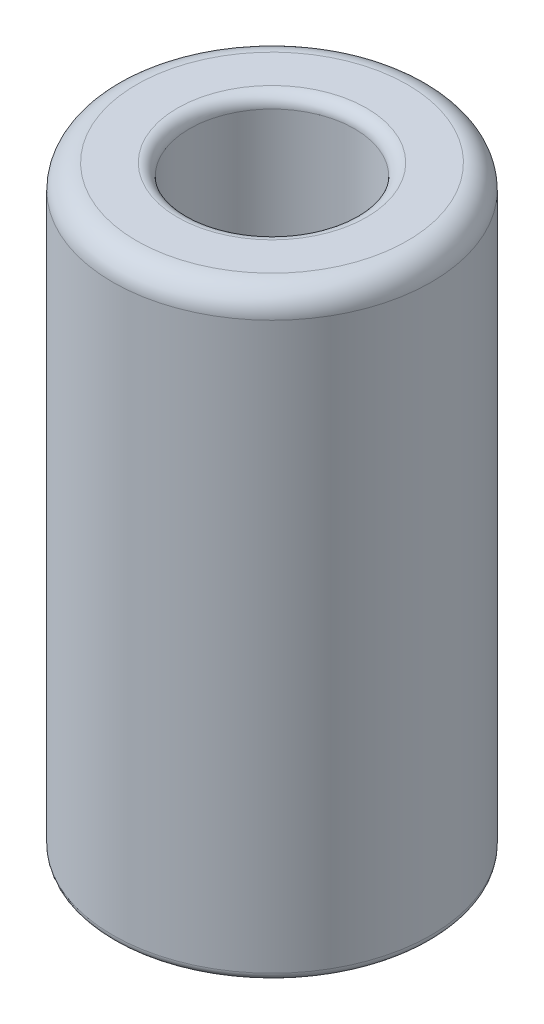
ISO-10303-21;
HEADER;
FILE_DESCRIPTION(('STEP AP214'),'2;1');
FILE_NAME('part.step','',(''),(''),'','','');
FILE_SCHEMA(('AUTOMOTIVE_DESIGN { 1 0 10303 214 1 1 1 1 }'));
ENDSEC;
DATA;
#1=APPLICATION_CONTEXT('core data for automotive mechanical design processes');
#2=APPLICATION_PROTOCOL_DEFINITION('international standard','automotive_design',2000,#1);
#3=PRODUCT_CONTEXT('',#1,'mechanical');
#4=PRODUCT('Part','Part','',(#3));
#5=PRODUCT_RELATED_PRODUCT_CATEGORY('part','',(#4));
#6=PRODUCT_DEFINITION_FORMATION('','',#4);
#7=PRODUCT_DEFINITION_CONTEXT('part definition',#1,'design');
#8=PRODUCT_DEFINITION('design','',#6,#7);
#9=PRODUCT_DEFINITION_SHAPE('','',#8);
#10=(LENGTH_UNIT() NAMED_UNIT(*) SI_UNIT(.MILLI.,.METRE.));
#11=(NAMED_UNIT(*) PLANE_ANGLE_UNIT() SI_UNIT($,.RADIAN.));
#12=(NAMED_UNIT(*) SI_UNIT($,.STERADIAN.) SOLID_ANGLE_UNIT());
#13=UNCERTAINTY_MEASURE_WITH_UNIT(LENGTH_MEASURE(1.E-05),#10,'distance_accuracy_value','');
#14=(GEOMETRIC_REPRESENTATION_CONTEXT(3) GLOBAL_UNCERTAINTY_ASSIGNED_CONTEXT((#13)) GLOBAL_UNIT_ASSIGNED_CONTEXT((#10,
#11,#12)) REPRESENTATION_CONTEXT('',''));
#15=CARTESIAN_POINT('',(0.,0.,0.));
#16=DIRECTION('',(0.,0.,1.));
#17=DIRECTION('',(1.,0.,0.));
#18=AXIS2_PLACEMENT_3D('',#15,#16,#17);
#19=CARTESIAN_POINT('',(0.,1.,0.));
#20=DIRECTION('',(0.,1.,0.));
#21=DIRECTION('',(0.,0.,1.));
#22=AXIS2_PLACEMENT_3D('',#19,#20,#21);
#23=TOROIDAL_SURFACE('',#22,19.,1.);
#24=CARTESIAN_POINT('',(0.,0.,0.));
#25=DIRECTION('',(0.,1.,0.));
#26=DIRECTION('',(0.,0.,1.));
#27=AXIS2_PLACEMENT_3D('',#24,#25,#26);
#28=CIRCLE('',#27,19.);
#29=CARTESIAN_POINT('',(0.,0.,19.));
#30=VERTEX_POINT('',#29);
#31=EDGE_CURVE('E37',#30,#30,#28,.F.);
#32=ORIENTED_EDGE('',*,*,#31,.F.);
#33=EDGE_LOOP('',(#32));
#34=FACE_BOUND('',#33,.T.);
#35=CARTESIAN_POINT('',(0.,1.,0.));
#36=DIRECTION('',(0.,1.,0.));
#37=DIRECTION('',(0.,0.,1.));
#38=AXIS2_PLACEMENT_3D('',#35,#36,#37);
#39=CIRCLE('',#38,20.);
#40=CARTESIAN_POINT('',(0.,1.,20.));
#41=VERTEX_POINT('',#40);
#42=EDGE_CURVE('E10',#41,#41,#39,.T.);
#43=ORIENTED_EDGE('',*,*,#42,.F.);
#44=EDGE_LOOP('',(#43));
#45=FACE_BOUND('',#44,.T.);
#46=ADVANCED_FACE('F31',(#34,#45),#23,.T.);
#47=CARTESIAN_POINT('',(0.,72.,0.));
#48=DIRECTION('',(0.,1.,0.));
#49=DIRECTION('',(0.,0.,1.));
#50=AXIS2_PLACEMENT_3D('',#47,#48,#49);
#51=TOROIDAL_SURFACE('',#50,17.,3.);
#52=CARTESIAN_POINT('',(0.,75.,0.));
#53=DIRECTION('',(0.,1.,0.));
#54=DIRECTION('',(0.,0.,1.));
#55=AXIS2_PLACEMENT_3D('',#52,#53,#54);
#56=CIRCLE('',#55,17.);
#57=CARTESIAN_POINT('',(0.,75.,17.));
#58=VERTEX_POINT('',#57);
#59=EDGE_CURVE('E45',#58,#58,#56,.T.);
#60=ORIENTED_EDGE('',*,*,#59,.F.);
#61=EDGE_LOOP('',(#60));
#62=FACE_BOUND('',#61,.T.);
#63=CARTESIAN_POINT('',(0.,72.,0.));
#64=DIRECTION('',(0.,1.,0.));
#65=DIRECTION('',(0.,0.,1.));
#66=AXIS2_PLACEMENT_3D('',#63,#64,#65);
#67=CIRCLE('',#66,20.);
#68=CARTESIAN_POINT('',(0.,72.,20.));
#69=VERTEX_POINT('',#68);
#70=EDGE_CURVE('E41',#69,#69,#67,.F.);
#71=ORIENTED_EDGE('',*,*,#70,.F.);
#72=EDGE_LOOP('',(#71));
#73=FACE_BOUND('',#72,.T.);
#74=ADVANCED_FACE('F88',(#62,#73),#51,.T.);
#75=CARTESIAN_POINT('',(0.,73.5,0.));
#76=DIRECTION('',(0.,1.,0.));
#77=DIRECTION('',(0.,0.,1.));
#78=AXIS2_PLACEMENT_3D('',#75,#76,#77);
#79=TOROIDAL_SURFACE('',#78,11.875,1.5);
#80=CARTESIAN_POINT('',(0.,75.,0.));
#81=DIRECTION('',(0.,1.,0.));
#82=DIRECTION('',(0.,0.,1.));
#83=AXIS2_PLACEMENT_3D('',#80,#81,#82);
#84=CIRCLE('',#83,11.875);
#85=CARTESIAN_POINT('',(0.,75.,11.875));
#86=VERTEX_POINT('',#85);
#87=EDGE_CURVE('E53',#86,#86,#84,.F.);
#88=ORIENTED_EDGE('',*,*,#87,.F.);
#89=EDGE_LOOP('',(#88));
#90=FACE_BOUND('',#89,.T.);
#91=CARTESIAN_POINT('',(0.,73.5,0.));
#92=DIRECTION('',(0.,1.,0.));
#93=DIRECTION('',(0.,0.,1.));
#94=AXIS2_PLACEMENT_3D('',#91,#92,#93);
#95=CIRCLE('',#94,10.375);
#96=CARTESIAN_POINT('',(0.,73.5,10.375));
#97=VERTEX_POINT('',#96);
#98=EDGE_CURVE('E50',#97,#97,#95,.T.);
#99=ORIENTED_EDGE('',*,*,#98,.F.);
#100=EDGE_LOOP('',(#99));
#101=FACE_BOUND('',#100,.T.);
#102=ADVANCED_FACE('F93',(#90,#101),#79,.T.);
#103=CARTESIAN_POINT('',(0.,1.5,0.));
#104=DIRECTION('',(0.,1.,0.));
#105=DIRECTION('',(0.,0.,1.));
#106=AXIS2_PLACEMENT_3D('',#103,#104,#105);
#107=TOROIDAL_SURFACE('',#106,14.25,1.5);
#108=CARTESIAN_POINT('',(0.,0.,0.));
#109=DIRECTION('',(0.,1.,0.));
#110=DIRECTION('',(0.,0.,1.));
#111=AXIS2_PLACEMENT_3D('',#108,#109,#110);
#112=CIRCLE('',#111,14.25);
#113=CARTESIAN_POINT('',(0.,0.,14.25));
#114=VERTEX_POINT('',#113);
#115=EDGE_CURVE('E59',#114,#114,#112,.T.);
#116=ORIENTED_EDGE('',*,*,#115,.F.);
#117=EDGE_LOOP('',(#116));
#118=FACE_BOUND('',#117,.T.);
#119=CARTESIAN_POINT('',(0.,1.5,0.));
#120=DIRECTION('',(0.,1.,0.));
#121=DIRECTION('',(0.,0.,1.));
#122=AXIS2_PLACEMENT_3D('',#119,#120,#121);
#123=CIRCLE('',#122,12.75);
#124=CARTESIAN_POINT('',(0.,1.5,12.75));
#125=VERTEX_POINT('',#124);
#126=EDGE_CURVE('E56',#125,#125,#123,.F.);
#127=ORIENTED_EDGE('',*,*,#126,.F.);
#128=EDGE_LOOP('',(#127));
#129=FACE_BOUND('',#128,.T.);
#130=ADVANCED_FACE('F99',(#118,#129),#107,.T.);
#131=CARTESIAN_POINT('',(0.,35.,0.));
#132=DIRECTION('',(0.,-1.,0.));
#133=DIRECTION('',(0.,0.,-1.));
#134=AXIS2_PLACEMENT_3D('',#131,#132,#133);
#135=CYLINDRICAL_SURFACE('',#134,20.);
#136=ORIENTED_EDGE('',*,*,#42,.T.);
#137=EDGE_LOOP('',(#136));
#138=FACE_BOUND('',#137,.T.);
#139=ORIENTED_EDGE('',*,*,#70,.T.);
#140=EDGE_LOOP('',(#139));
#141=FACE_BOUND('',#140,.T.);
#142=ADVANCED_FACE('F107',(#138,#141),#135,.T.);
#143=CARTESIAN_POINT('',(0.,0.,0.));
#144=DIRECTION('',(0.,1.,0.));
#145=DIRECTION('',(0.,0.,1.));
#146=AXIS2_PLACEMENT_3D('',#143,#144,#145);
#147=PLANE('',#146);
#148=ORIENTED_EDGE('',*,*,#31,.T.);
#149=EDGE_LOOP('',(#148));
#150=FACE_BOUND('',#149,.T.);
#151=ORIENTED_EDGE('',*,*,#115,.T.);
#152=EDGE_LOOP('',(#151));
#153=FACE_BOUND('',#152,.T.);
#154=ADVANCED_FACE('F111',(#150,#153),#147,.F.);
#155=CARTESIAN_POINT('',(0.,71.0624458405139,0.));
#156=DIRECTION('',(0.,-1.,0.));
#157=DIRECTION('',(0.,0.,-1.));
#158=AXIS2_PLACEMENT_3D('',#155,#156,#157);
#159=CYLINDRICAL_SURFACE('',#158,12.75);
#160=ORIENTED_EDGE('',*,*,#126,.T.);
#161=EDGE_LOOP('',(#160));
#162=FACE_BOUND('',#161,.T.);
#163=CARTESIAN_POINT('',(0.,35.,0.));
#164=DIRECTION('',(0.,-1.,0.));
#165=DIRECTION('',(0.,0.,-1.));
#166=AXIS2_PLACEMENT_3D('',#163,#164,#165);
#167=CIRCLE('',#166,12.75);
#168=CARTESIAN_POINT('',(0.,35.,-12.75));
#169=VERTEX_POINT('',#168);
#170=EDGE_CURVE('E62',#169,#169,#167,.T.);
#171=ORIENTED_EDGE('',*,*,#170,.F.);
#172=EDGE_LOOP('',(#171));
#173=FACE_BOUND('',#172,.T.);
#174=ADVANCED_FACE('F114',(#162,#173),#159,.F.);
#175=CARTESIAN_POINT('',(0.,35.,0.));
#176=DIRECTION('',(0.,-1.,0.));
#177=DIRECTION('',(0.,0.,-1.));
#178=AXIS2_PLACEMENT_3D('',#175,#176,#177);
#179=CONICAL_SURFACE('',#178,12.75,0.78539816339745);
#180=CARTESIAN_POINT('',(0.,40.,0.));
#181=DIRECTION('',(0.,1.,0.));
#182=DIRECTION('',(0.,0.,1.));
#183=AXIS2_PLACEMENT_3D('',#180,#181,#182);
#184=CIRCLE('',#183,7.74999999999998);
#185=CARTESIAN_POINT('',(0.,40.,7.74999999999998));
#186=VERTEX_POINT('',#185);
#187=EDGE_CURVE('E65',#186,#186,#184,.F.);
#188=ORIENTED_EDGE('',*,*,#187,.F.);
#189=EDGE_LOOP('',(#188));
#190=FACE_BOUND('',#189,.T.);
#191=ORIENTED_EDGE('',*,*,#170,.T.);
#192=EDGE_LOOP('',(#191));
#193=FACE_BOUND('',#192,.T.);
#194=ADVANCED_FACE('F117',(#190,#193),#179,.F.);
#195=CARTESIAN_POINT('',(0.,40.,0.));
#196=DIRECTION('',(0.,1.,0.));
#197=DIRECTION('',(0.,0.,1.));
#198=AXIS2_PLACEMENT_3D('',#195,#196,#197);
#199=PLANE('',#198);
#200=ORIENTED_EDGE('',*,*,#187,.T.);
#201=EDGE_LOOP('',(#200));
#202=FACE_BOUND('',#201,.T.);
#203=ADVANCED_FACE('F84',(#202),#199,.F.);
#204=CARTESIAN_POINT('',(0.,75.,0.));
#205=DIRECTION('',(0.,1.,0.));
#206=DIRECTION('',(0.,0.,1.));
#207=AXIS2_PLACEMENT_3D('',#204,#205,#206);
#208=PLANE('',#207);
#209=ORIENTED_EDGE('',*,*,#59,.T.);
#210=EDGE_LOOP('',(#209));
#211=FACE_BOUND('',#210,.T.);
#212=ORIENTED_EDGE('',*,*,#87,.T.);
#213=EDGE_LOOP('',(#212));
#214=FACE_BOUND('',#213,.T.);
#215=ADVANCED_FACE('F76',(#211,#214),#208,.T.);
#216=CARTESIAN_POINT('',(0.,42.,0.));
#217=DIRECTION('',(0.,1.,0.));
#218=DIRECTION('',(0.,0.,1.));
#219=AXIS2_PLACEMENT_3D('',#216,#217,#218);
#220=CYLINDRICAL_SURFACE('',#219,10.375);
#221=ORIENTED_EDGE('',*,*,#98,.T.);
#222=EDGE_LOOP('',(#221));
#223=FACE_BOUND('',#222,.T.);
#224=CARTESIAN_POINT('',(0.,42.,0.));
#225=DIRECTION('',(0.,1.,0.));
#226=DIRECTION('',(0.,0.,1.));
#227=AXIS2_PLACEMENT_3D('',#224,#225,#226);
#228=CIRCLE('',#227,10.375);
#229=CARTESIAN_POINT('',(0.,42.,10.375));
#230=VERTEX_POINT('',#229);
#231=EDGE_CURVE('E68',#230,#230,#228,.T.);
#232=ORIENTED_EDGE('',*,*,#231,.F.);
#233=EDGE_LOOP('',(#232));
#234=FACE_BOUND('',#233,.T.);
#235=ADVANCED_FACE('F74',(#223,#234),#220,.F.);
#236=CARTESIAN_POINT('',(0.,42.,0.));
#237=DIRECTION('',(0.,1.,0.));
#238=DIRECTION('',(0.,0.,1.));
#239=AXIS2_PLACEMENT_3D('',#236,#237,#238);
#240=PLANE('',#239);
#241=ORIENTED_EDGE('',*,*,#231,.T.);
#242=EDGE_LOOP('',(#241));
#243=FACE_BOUND('',#242,.T.);
#244=ADVANCED_FACE('F72',(#243),#240,.T.);
#245=CLOSED_SHELL('',(#46,#74,#102,#130,#142,#154,#174,#194,#203,#215,#235,#244));
#246=MANIFOLD_SOLID_BREP('B2',#245);
#247=ADVANCED_BREP_SHAPE_REPRESENTATION('',(#18,#246),#14);
#248=SHAPE_DEFINITION_REPRESENTATION(#9,#247);
ENDSEC;
END-ISO-10303-21;
